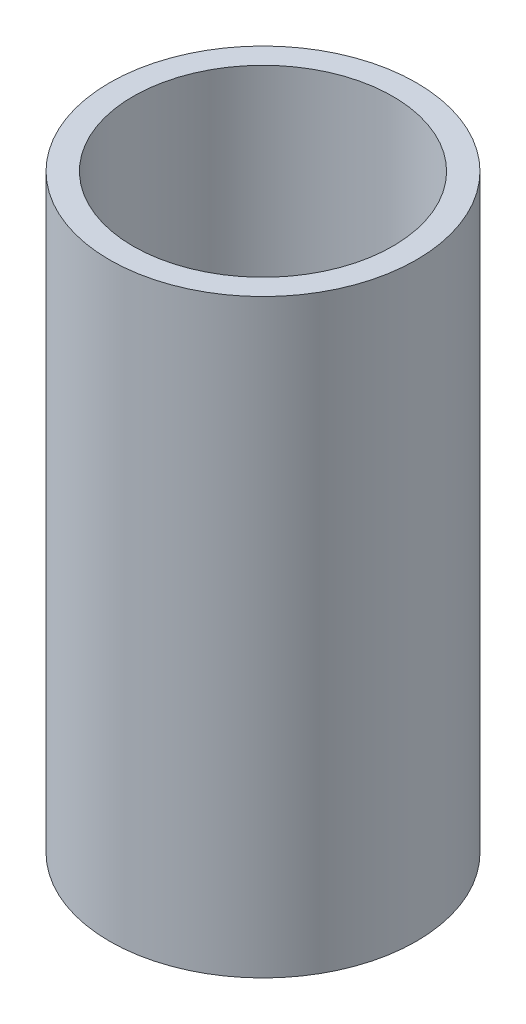
ISO-10303-21;
HEADER;
FILE_DESCRIPTION(('STEP AP214'),'2;1');
FILE_NAME('part.step','',(''),(''),'','','');
FILE_SCHEMA(('AUTOMOTIVE_DESIGN { 1 0 10303 214 1 1 1 1 }'));
ENDSEC;
DATA;
#1=APPLICATION_CONTEXT('core data for automotive mechanical design processes');
#2=APPLICATION_PROTOCOL_DEFINITION('international standard','automotive_design',2000,#1);
#3=PRODUCT_CONTEXT('',#1,'mechanical');
#4=PRODUCT('Part','Part','',(#3));
#5=PRODUCT_RELATED_PRODUCT_CATEGORY('part','',(#4));
#6=PRODUCT_DEFINITION_FORMATION('','',#4);
#7=PRODUCT_DEFINITION_CONTEXT('part definition',#1,'design');
#8=PRODUCT_DEFINITION('design','',#6,#7);
#9=PRODUCT_DEFINITION_SHAPE('','',#8);
#10=(LENGTH_UNIT() NAMED_UNIT(*) SI_UNIT(.MILLI.,.METRE.));
#11=(NAMED_UNIT(*) PLANE_ANGLE_UNIT() SI_UNIT($,.RADIAN.));
#12=(NAMED_UNIT(*) SI_UNIT($,.STERADIAN.) SOLID_ANGLE_UNIT());
#13=UNCERTAINTY_MEASURE_WITH_UNIT(LENGTH_MEASURE(1.E-05),#10,'distance_accuracy_value','');
#14=(GEOMETRIC_REPRESENTATION_CONTEXT(3) GLOBAL_UNCERTAINTY_ASSIGNED_CONTEXT((#13)) GLOBAL_UNIT_ASSIGNED_CONTEXT((#10,
#11,#12)) REPRESENTATION_CONTEXT('',''));
#15=CARTESIAN_POINT('',(0.,0.,0.));
#16=DIRECTION('',(0.,0.,1.));
#17=DIRECTION('',(1.,0.,0.));
#18=AXIS2_PLACEMENT_3D('',#15,#16,#17);
#19=CARTESIAN_POINT('',(0.,10.,0.));
#20=DIRECTION('',(0.,1.,0.));
#21=DIRECTION('',(0.,0.,1.));
#22=AXIS2_PLACEMENT_3D('',#19,#20,#21);
#23=PLANE('',#22);
#24=CARTESIAN_POINT('',(0.,10.,0.));
#25=DIRECTION('',(0.,1.,0.));
#26=DIRECTION('',(0.,0.,1.));
#27=AXIS2_PLACEMENT_3D('',#24,#25,#26);
#28=CIRCLE('',#27,2.6);
#29=CARTESIAN_POINT('',(0.,10.,2.6));
#30=VERTEX_POINT('',#29);
#31=EDGE_CURVE('E10',#30,#30,#28,.T.);
#32=ORIENTED_EDGE('',*,*,#31,.T.);
#33=EDGE_LOOP('',(#32));
#34=FACE_BOUND('',#33,.T.);
#35=CARTESIAN_POINT('',(0.,10.,0.));
#36=DIRECTION('',(0.,1.,0.));
#37=DIRECTION('',(0.,0.,1.));
#38=AXIS2_PLACEMENT_3D('',#35,#36,#37);
#39=CIRCLE('',#38,2.2);
#40=CARTESIAN_POINT('',(0.,10.,2.2));
#41=VERTEX_POINT('',#40);
#42=EDGE_CURVE('E42',#41,#41,#39,.T.);
#43=ORIENTED_EDGE('',*,*,#42,.F.);
#44=EDGE_LOOP('',(#43));
#45=FACE_BOUND('',#44,.T.);
#46=ADVANCED_FACE('F31',(#34,#45),#23,.T.);
#47=CARTESIAN_POINT('',(0.,0.,0.));
#48=DIRECTION('',(0.,1.,0.));
#49=DIRECTION('',(0.,0.,1.));
#50=AXIS2_PLACEMENT_3D('',#47,#48,#49);
#51=PLANE('',#50);
#52=CARTESIAN_POINT('',(0.,0.,0.));
#53=DIRECTION('',(0.,1.,0.));
#54=DIRECTION('',(0.,0.,1.));
#55=AXIS2_PLACEMENT_3D('',#52,#53,#54);
#56=CIRCLE('',#55,2.6);
#57=CARTESIAN_POINT('',(0.,0.,2.6));
#58=VERTEX_POINT('',#57);
#59=EDGE_CURVE('E35',#58,#58,#56,.T.);
#60=ORIENTED_EDGE('',*,*,#59,.F.);
#61=EDGE_LOOP('',(#60));
#62=FACE_BOUND('',#61,.T.);
#63=CARTESIAN_POINT('',(0.,0.,0.));
#64=DIRECTION('',(0.,1.,0.));
#65=DIRECTION('',(0.,0.,1.));
#66=AXIS2_PLACEMENT_3D('',#63,#64,#65);
#67=CIRCLE('',#66,2.2);
#68=CARTESIAN_POINT('',(0.,0.,2.2));
#69=VERTEX_POINT('',#68);
#70=EDGE_CURVE('E44',#69,#69,#67,.T.);
#71=ORIENTED_EDGE('',*,*,#70,.T.);
#72=EDGE_LOOP('',(#71));
#73=FACE_BOUND('',#72,.T.);
#74=ADVANCED_FACE('F54',(#62,#73),#51,.F.);
#75=CARTESIAN_POINT('',(0.,10.,0.));
#76=DIRECTION('',(0.,-1.,0.));
#77=DIRECTION('',(0.,0.,-1.));
#78=AXIS2_PLACEMENT_3D('',#75,#76,#77);
#79=CYLINDRICAL_SURFACE('',#78,2.6);
#80=ORIENTED_EDGE('',*,*,#31,.F.);
#81=EDGE_LOOP('',(#80));
#82=FACE_BOUND('',#81,.T.);
#83=ORIENTED_EDGE('',*,*,#59,.T.);
#84=EDGE_LOOP('',(#83));
#85=FACE_BOUND('',#84,.T.);
#86=ADVANCED_FACE('F33',(#82,#85),#79,.T.);
#87=CARTESIAN_POINT('',(0.,10.,0.));
#88=DIRECTION('',(0.,-1.,0.));
#89=DIRECTION('',(0.,0.,-1.));
#90=AXIS2_PLACEMENT_3D('',#87,#88,#89);
#91=CYLINDRICAL_SURFACE('',#90,2.2);
#92=ORIENTED_EDGE('',*,*,#42,.T.);
#93=EDGE_LOOP('',(#92));
#94=FACE_BOUND('',#93,.T.);
#95=ORIENTED_EDGE('',*,*,#70,.F.);
#96=EDGE_LOOP('',(#95));
#97=FACE_BOUND('',#96,.T.);
#98=ADVANCED_FACE('F50',(#94,#97),#91,.F.);
#99=CLOSED_SHELL('',(#46,#74,#86,#98));
#100=MANIFOLD_SOLID_BREP('B2',#99);
#101=ADVANCED_BREP_SHAPE_REPRESENTATION('',(#18,#100),#14);
#102=SHAPE_DEFINITION_REPRESENTATION(#9,#101);
ENDSEC;
END-ISO-10303-21;
